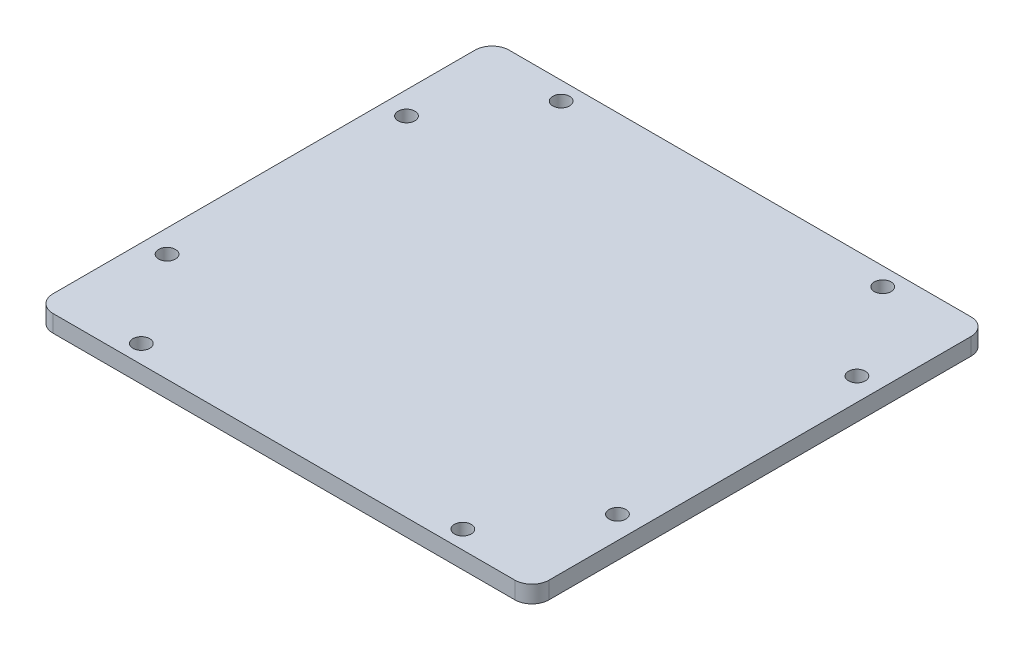
ISO-10303-21;
HEADER;
FILE_DESCRIPTION(('STEP AP214'),'2;1');
FILE_NAME('part.step','',(''),(''),'','','');
FILE_SCHEMA(('AUTOMOTIVE_DESIGN { 1 0 10303 214 1 1 1 1 }'));
ENDSEC;
DATA;
#1=APPLICATION_CONTEXT('core data for automotive mechanical design processes');
#2=APPLICATION_PROTOCOL_DEFINITION('international standard','automotive_design',2000,#1);
#3=PRODUCT_CONTEXT('',#1,'mechanical');
#4=PRODUCT('Part','Part','',(#3));
#5=PRODUCT_RELATED_PRODUCT_CATEGORY('part','',(#4));
#6=PRODUCT_DEFINITION_FORMATION('','',#4);
#7=PRODUCT_DEFINITION_CONTEXT('part definition',#1,'design');
#8=PRODUCT_DEFINITION('design','',#6,#7);
#9=PRODUCT_DEFINITION_SHAPE('','',#8);
#10=(LENGTH_UNIT() NAMED_UNIT(*) SI_UNIT(.MILLI.,.METRE.));
#11=(NAMED_UNIT(*) PLANE_ANGLE_UNIT() SI_UNIT($,.RADIAN.));
#12=(NAMED_UNIT(*) SI_UNIT($,.STERADIAN.) SOLID_ANGLE_UNIT());
#13=UNCERTAINTY_MEASURE_WITH_UNIT(LENGTH_MEASURE(1.E-05),#10,'distance_accuracy_value','');
#14=(GEOMETRIC_REPRESENTATION_CONTEXT(3) GLOBAL_UNCERTAINTY_ASSIGNED_CONTEXT((#13)) GLOBAL_UNIT_ASSIGNED_CONTEXT((#10,
#11,#12)) REPRESENTATION_CONTEXT('',''));
#15=CARTESIAN_POINT('',(0.,0.,0.));
#16=DIRECTION('',(0.,0.,1.));
#17=DIRECTION('',(1.,0.,0.));
#18=AXIS2_PLACEMENT_3D('',#15,#16,#17);
#19=CARTESIAN_POINT('',(40.5,3.,37.));
#20=DIRECTION('',(0.,-1.,0.));
#21=DIRECTION('',(0.,0.,-1.));
#22=AXIS2_PLACEMENT_3D('',#19,#20,#21);
#23=PLANE('',#22);
#24=CARTESIAN_POINT('',(40.5,3.,37.));
#25=DIRECTION('',(0.,1.,0.));
#26=DIRECTION('',(0.,0.,-1.));
#27=AXIS2_PLACEMENT_3D('',#24,#25,#26);
#28=CIRCLE('',#27,3.);
#29=CARTESIAN_POINT('',(40.5,3.,40.));
#30=VERTEX_POINT('',#29);
#31=CARTESIAN_POINT('',(43.5,3.,37.));
#32=VERTEX_POINT('',#31);
#33=EDGE_CURVE('E147',#30,#32,#28,.T.);
#34=ORIENTED_EDGE('',*,*,#33,.T.);
#35=DIRECTION('',(0.,0.,-1.));
#36=VECTOR('',#35,1.);
#37=CARTESIAN_POINT('',(43.5,3.,-37.));
#38=LINE('',#37,#36);
#39=CARTESIAN_POINT('',(43.5,3.,-37.));
#40=VERTEX_POINT('',#39);
#41=EDGE_CURVE('E95',#32,#40,#38,.T.);
#42=ORIENTED_EDGE('',*,*,#41,.T.);
#43=CARTESIAN_POINT('',(40.5,3.,-37.));
#44=DIRECTION('',(0.,1.,0.));
#45=DIRECTION('',(0.,0.,1.));
#46=AXIS2_PLACEMENT_3D('',#43,#44,#45);
#47=CIRCLE('',#46,3.);
#48=CARTESIAN_POINT('',(40.5,3.,-40.));
#49=VERTEX_POINT('',#48);
#50=EDGE_CURVE('E162',#40,#49,#47,.T.);
#51=ORIENTED_EDGE('',*,*,#50,.T.);
#52=DIRECTION('',(-1.,0.,0.));
#53=VECTOR('',#52,1.);
#54=CARTESIAN_POINT('',(-40.5,3.,-40.));
#55=LINE('',#54,#53);
#56=CARTESIAN_POINT('',(-40.5,3.,-40.));
#57=VERTEX_POINT('',#56);
#58=EDGE_CURVE('E175',#49,#57,#55,.T.);
#59=ORIENTED_EDGE('',*,*,#58,.T.);
#60=CARTESIAN_POINT('',(-40.5,3.,-37.));
#61=DIRECTION('',(0.,1.,0.));
#62=DIRECTION('',(0.,0.,1.));
#63=AXIS2_PLACEMENT_3D('',#60,#61,#62);
#64=CIRCLE('',#63,3.);
#65=CARTESIAN_POINT('',(-43.5,3.,-37.));
#66=VERTEX_POINT('',#65);
#67=EDGE_CURVE('E114',#57,#66,#64,.T.);
#68=ORIENTED_EDGE('',*,*,#67,.T.);
#69=DIRECTION('',(0.,0.,1.));
#70=VECTOR('',#69,1.);
#71=CARTESIAN_POINT('',(-43.5,3.,-37.));
#72=LINE('',#71,#70);
#73=CARTESIAN_POINT('',(-43.5,3.,37.));
#74=VERTEX_POINT('',#73);
#75=EDGE_CURVE('E108',#66,#74,#72,.T.);
#76=ORIENTED_EDGE('',*,*,#75,.T.);
#77=CARTESIAN_POINT('',(-40.5,3.,37.));
#78=DIRECTION('',(0.,1.,0.));
#79=DIRECTION('',(0.,0.,-1.));
#80=AXIS2_PLACEMENT_3D('',#77,#78,#79);
#81=CIRCLE('',#80,3.);
#82=CARTESIAN_POINT('',(-40.5,3.,40.));
#83=VERTEX_POINT('',#82);
#84=EDGE_CURVE('E112',#74,#83,#81,.T.);
#85=ORIENTED_EDGE('',*,*,#84,.T.);
#86=DIRECTION('',(1.,0.,0.));
#87=VECTOR('',#86,1.);
#88=CARTESIAN_POINT('',(-40.5,3.,40.));
#89=LINE('',#88,#87);
#90=EDGE_CURVE('E52',#83,#30,#89,.T.);
#91=ORIENTED_EDGE('',*,*,#90,.T.);
#92=EDGE_LOOP('',(#34,#42,#51,#59,#68,#76,#85,#91));
#93=FACE_BOUND('',#92,.T.);
#94=CARTESIAN_POINT('',(28.198,3.,36.819));
#95=DIRECTION('',(0.,1.,0.));
#96=DIRECTION('',(0.,0.,1.));
#97=AXIS2_PLACEMENT_3D('',#94,#95,#96);
#98=CIRCLE('',#97,1.475);
#99=CARTESIAN_POINT('',(28.198,3.,38.294));
#100=VERTEX_POINT('',#99);
#101=EDGE_CURVE('E136',#100,#100,#98,.T.);
#102=ORIENTED_EDGE('',*,*,#101,.F.);
#103=EDGE_LOOP('',(#102));
#104=FACE_BOUND('',#103,.T.);
#105=CARTESIAN_POINT('',(28.198,3.,-36.819));
#106=DIRECTION('',(0.,1.,0.));
#107=DIRECTION('',(0.,0.,-1.));
#108=AXIS2_PLACEMENT_3D('',#105,#106,#107);
#109=CIRCLE('',#108,1.475);
#110=CARTESIAN_POINT('',(28.198,3.,-38.294));
#111=VERTEX_POINT('',#110);
#112=EDGE_CURVE('E184',#111,#111,#109,.T.);
#113=ORIENTED_EDGE('',*,*,#112,.F.);
#114=EDGE_LOOP('',(#113));
#115=FACE_BOUND('',#114,.T.);
#116=CARTESIAN_POINT('',(-28.198,3.,-36.819));
#117=DIRECTION('',(0.,1.,0.));
#118=DIRECTION('',(0.,0.,1.));
#119=AXIS2_PLACEMENT_3D('',#116,#117,#118);
#120=CIRCLE('',#119,1.475);
#121=CARTESIAN_POINT('',(-28.198,3.,-35.344));
#122=VERTEX_POINT('',#121);
#123=EDGE_CURVE('E190',#122,#122,#120,.T.);
#124=ORIENTED_EDGE('',*,*,#123,.F.);
#125=EDGE_LOOP('',(#124));
#126=FACE_BOUND('',#125,.T.);
#127=CARTESIAN_POINT('',(-28.198,3.,36.819));
#128=DIRECTION('',(0.,1.,0.));
#129=DIRECTION('',(0.,0.,-1.));
#130=AXIS2_PLACEMENT_3D('',#127,#128,#129);
#131=CIRCLE('',#130,1.475);
#132=CARTESIAN_POINT('',(-28.198,3.,35.344));
#133=VERTEX_POINT('',#132);
#134=EDGE_CURVE('E196',#133,#133,#131,.T.);
#135=ORIENTED_EDGE('',*,*,#134,.F.);
#136=EDGE_LOOP('',(#135));
#137=FACE_BOUND('',#136,.T.);
#138=CARTESIAN_POINT('',(39.5,3.,-21.));
#139=DIRECTION('',(0.,1.,0.));
#140=DIRECTION('',(0.,0.,1.));
#141=AXIS2_PLACEMENT_3D('',#138,#139,#140);
#142=CIRCLE('',#141,1.475);
#143=CARTESIAN_POINT('',(39.5,3.,-19.525));
#144=VERTEX_POINT('',#143);
#145=EDGE_CURVE('E202',#144,#144,#142,.T.);
#146=ORIENTED_EDGE('',*,*,#145,.F.);
#147=EDGE_LOOP('',(#146));
#148=FACE_BOUND('',#147,.T.);
#149=CARTESIAN_POINT('',(-39.5,3.,-21.));
#150=DIRECTION('',(0.,1.,0.));
#151=DIRECTION('',(0.,0.,-1.));
#152=AXIS2_PLACEMENT_3D('',#149,#150,#151);
#153=CIRCLE('',#152,1.475);
#154=CARTESIAN_POINT('',(-39.5,3.,-22.475));
#155=VERTEX_POINT('',#154);
#156=EDGE_CURVE('E208',#155,#155,#153,.T.);
#157=ORIENTED_EDGE('',*,*,#156,.F.);
#158=EDGE_LOOP('',(#157));
#159=FACE_BOUND('',#158,.T.);
#160=CARTESIAN_POINT('',(39.5,3.,21.));
#161=DIRECTION('',(0.,1.,0.));
#162=DIRECTION('',(0.,0.,-1.));
#163=AXIS2_PLACEMENT_3D('',#160,#161,#162);
#164=CIRCLE('',#163,1.475);
#165=CARTESIAN_POINT('',(39.5,3.,19.525));
#166=VERTEX_POINT('',#165);
#167=EDGE_CURVE('E214',#166,#166,#164,.T.);
#168=ORIENTED_EDGE('',*,*,#167,.F.);
#169=EDGE_LOOP('',(#168));
#170=FACE_BOUND('',#169,.T.);
#171=CARTESIAN_POINT('',(-39.5,3.,21.));
#172=DIRECTION('',(0.,1.,0.));
#173=DIRECTION('',(0.,0.,1.));
#174=AXIS2_PLACEMENT_3D('',#171,#172,#173);
#175=CIRCLE('',#174,1.475);
#176=CARTESIAN_POINT('',(-39.5,3.,22.475));
#177=VERTEX_POINT('',#176);
#178=EDGE_CURVE('E220',#177,#177,#175,.T.);
#179=ORIENTED_EDGE('',*,*,#178,.F.);
#180=EDGE_LOOP('',(#179));
#181=FACE_BOUND('',#180,.T.);
#182=ADVANCED_FACE('F35',(#93,#104,#115,#126,#137,#148,#159,#170,#181),#23,.F.);
#183=CARTESIAN_POINT('',(40.5,0.,37.));
#184=DIRECTION('',(0.,-1.,0.));
#185=DIRECTION('',(0.,0.,-1.));
#186=AXIS2_PLACEMENT_3D('',#183,#184,#185);
#187=PLANE('',#186);
#188=CARTESIAN_POINT('',(39.5,0.,21.));
#189=DIRECTION('',(0.,1.,0.));
#190=DIRECTION('',(0.,0.,-1.));
#191=AXIS2_PLACEMENT_3D('',#188,#189,#190);
#192=CIRCLE('',#191,1.475);
#193=CARTESIAN_POINT('',(39.5,0.,19.525));
#194=VERTEX_POINT('',#193);
#195=EDGE_CURVE('E217',#194,#194,#192,.T.);
#196=ORIENTED_EDGE('',*,*,#195,.T.);
#197=EDGE_LOOP('',(#196));
#198=FACE_BOUND('',#197,.T.);
#199=CARTESIAN_POINT('',(39.5,0.,-21.));
#200=DIRECTION('',(0.,1.,0.));
#201=DIRECTION('',(0.,0.,1.));
#202=AXIS2_PLACEMENT_3D('',#199,#200,#201);
#203=CIRCLE('',#202,1.475);
#204=CARTESIAN_POINT('',(39.5,0.,-19.525));
#205=VERTEX_POINT('',#204);
#206=EDGE_CURVE('E205',#205,#205,#203,.T.);
#207=ORIENTED_EDGE('',*,*,#206,.T.);
#208=EDGE_LOOP('',(#207));
#209=FACE_BOUND('',#208,.T.);
#210=CARTESIAN_POINT('',(-28.198,0.,-36.819));
#211=DIRECTION('',(0.,1.,0.));
#212=DIRECTION('',(0.,0.,1.));
#213=AXIS2_PLACEMENT_3D('',#210,#211,#212);
#214=CIRCLE('',#213,1.475);
#215=CARTESIAN_POINT('',(-28.198,0.,-35.344));
#216=VERTEX_POINT('',#215);
#217=EDGE_CURVE('E193',#216,#216,#214,.T.);
#218=ORIENTED_EDGE('',*,*,#217,.T.);
#219=EDGE_LOOP('',(#218));
#220=FACE_BOUND('',#219,.T.);
#221=CARTESIAN_POINT('',(28.198,0.,36.819));
#222=DIRECTION('',(0.,1.,0.));
#223=DIRECTION('',(0.,0.,1.));
#224=AXIS2_PLACEMENT_3D('',#221,#222,#223);
#225=CIRCLE('',#224,1.475);
#226=CARTESIAN_POINT('',(28.198,0.,38.294));
#227=VERTEX_POINT('',#226);
#228=EDGE_CURVE('E181',#227,#227,#225,.T.);
#229=ORIENTED_EDGE('',*,*,#228,.T.);
#230=EDGE_LOOP('',(#229));
#231=FACE_BOUND('',#230,.T.);
#232=CARTESIAN_POINT('',(40.5,0.,37.));
#233=DIRECTION('',(0.,1.,0.));
#234=DIRECTION('',(0.,0.,-1.));
#235=AXIS2_PLACEMENT_3D('',#232,#233,#234);
#236=CIRCLE('',#235,3.);
#237=CARTESIAN_POINT('',(40.5,0.,40.));
#238=VERTEX_POINT('',#237);
#239=CARTESIAN_POINT('',(43.5,0.,37.));
#240=VERTEX_POINT('',#239);
#241=EDGE_CURVE('E132',#238,#240,#236,.T.);
#242=ORIENTED_EDGE('',*,*,#241,.F.);
#243=DIRECTION('',(1.,0.,0.));
#244=VECTOR('',#243,1.);
#245=CARTESIAN_POINT('',(-40.5,0.,40.));
#246=LINE('',#245,#244);
#247=CARTESIAN_POINT('',(-40.5,0.,40.));
#248=VERTEX_POINT('',#247);
#249=EDGE_CURVE('E87',#248,#238,#246,.T.);
#250=ORIENTED_EDGE('',*,*,#249,.F.);
#251=CARTESIAN_POINT('',(-40.5,0.,37.));
#252=DIRECTION('',(0.,1.,0.));
#253=DIRECTION('',(0.,0.,-1.));
#254=AXIS2_PLACEMENT_3D('',#251,#252,#253);
#255=CIRCLE('',#254,3.);
#256=CARTESIAN_POINT('',(-43.5,0.,37.));
#257=VERTEX_POINT('',#256);
#258=EDGE_CURVE('E81',#257,#248,#255,.T.);
#259=ORIENTED_EDGE('',*,*,#258,.F.);
#260=DIRECTION('',(0.,0.,1.));
#261=VECTOR('',#260,1.);
#262=CARTESIAN_POINT('',(-43.5,0.,-37.));
#263=LINE('',#262,#261);
#264=CARTESIAN_POINT('',(-43.5,0.,-37.));
#265=VERTEX_POINT('',#264);
#266=EDGE_CURVE('E122',#265,#257,#263,.T.);
#267=ORIENTED_EDGE('',*,*,#266,.F.);
#268=CARTESIAN_POINT('',(-40.5,0.,-37.));
#269=DIRECTION('',(0.,1.,0.));
#270=DIRECTION('',(0.,0.,1.));
#271=AXIS2_PLACEMENT_3D('',#268,#269,#270);
#272=CIRCLE('',#271,3.);
#273=CARTESIAN_POINT('',(-40.5,0.,-40.));
#274=VERTEX_POINT('',#273);
#275=EDGE_CURVE('E142',#274,#265,#272,.T.);
#276=ORIENTED_EDGE('',*,*,#275,.F.);
#277=DIRECTION('',(-1.,0.,0.));
#278=VECTOR('',#277,1.);
#279=CARTESIAN_POINT('',(-40.5,0.,-40.));
#280=LINE('',#279,#278);
#281=CARTESIAN_POINT('',(40.5,0.,-40.));
#282=VERTEX_POINT('',#281);
#283=EDGE_CURVE('E140',#282,#274,#280,.T.);
#284=ORIENTED_EDGE('',*,*,#283,.F.);
#285=CARTESIAN_POINT('',(40.5,0.,-37.));
#286=DIRECTION('',(0.,1.,0.));
#287=DIRECTION('',(0.,0.,1.));
#288=AXIS2_PLACEMENT_3D('',#285,#286,#287);
#289=CIRCLE('',#288,3.);
#290=CARTESIAN_POINT('',(43.5,0.,-37.));
#291=VERTEX_POINT('',#290);
#292=EDGE_CURVE('E138',#291,#282,#289,.T.);
#293=ORIENTED_EDGE('',*,*,#292,.F.);
#294=DIRECTION('',(0.,0.,-1.));
#295=VECTOR('',#294,1.);
#296=CARTESIAN_POINT('',(43.5,0.,-37.));
#297=LINE('',#296,#295);
#298=EDGE_CURVE('E135',#240,#291,#297,.T.);
#299=ORIENTED_EDGE('',*,*,#298,.F.);
#300=EDGE_LOOP('',(#242,#250,#259,#267,#276,#284,#293,#299));
#301=FACE_BOUND('',#300,.T.);
#302=CARTESIAN_POINT('',(28.198,0.,-36.819));
#303=DIRECTION('',(0.,1.,0.));
#304=DIRECTION('',(0.,0.,-1.));
#305=AXIS2_PLACEMENT_3D('',#302,#303,#304);
#306=CIRCLE('',#305,1.475);
#307=CARTESIAN_POINT('',(28.198,0.,-38.294));
#308=VERTEX_POINT('',#307);
#309=EDGE_CURVE('E187',#308,#308,#306,.T.);
#310=ORIENTED_EDGE('',*,*,#309,.T.);
#311=EDGE_LOOP('',(#310));
#312=FACE_BOUND('',#311,.T.);
#313=CARTESIAN_POINT('',(-28.198,0.,36.819));
#314=DIRECTION('',(0.,1.,0.));
#315=DIRECTION('',(0.,0.,-1.));
#316=AXIS2_PLACEMENT_3D('',#313,#314,#315);
#317=CIRCLE('',#316,1.475);
#318=CARTESIAN_POINT('',(-28.198,0.,35.344));
#319=VERTEX_POINT('',#318);
#320=EDGE_CURVE('E199',#319,#319,#317,.T.);
#321=ORIENTED_EDGE('',*,*,#320,.T.);
#322=EDGE_LOOP('',(#321));
#323=FACE_BOUND('',#322,.T.);
#324=CARTESIAN_POINT('',(-39.5,0.,-21.));
#325=DIRECTION('',(0.,1.,0.));
#326=DIRECTION('',(0.,0.,-1.));
#327=AXIS2_PLACEMENT_3D('',#324,#325,#326);
#328=CIRCLE('',#327,1.475);
#329=CARTESIAN_POINT('',(-39.5,0.,-22.475));
#330=VERTEX_POINT('',#329);
#331=EDGE_CURVE('E211',#330,#330,#328,.T.);
#332=ORIENTED_EDGE('',*,*,#331,.T.);
#333=EDGE_LOOP('',(#332));
#334=FACE_BOUND('',#333,.T.);
#335=CARTESIAN_POINT('',(-39.5,0.,21.));
#336=DIRECTION('',(0.,1.,0.));
#337=DIRECTION('',(0.,0.,1.));
#338=AXIS2_PLACEMENT_3D('',#335,#336,#337);
#339=CIRCLE('',#338,1.475);
#340=CARTESIAN_POINT('',(-39.5,0.,22.475));
#341=VERTEX_POINT('',#340);
#342=EDGE_CURVE('E223',#341,#341,#339,.T.);
#343=ORIENTED_EDGE('',*,*,#342,.T.);
#344=EDGE_LOOP('',(#343));
#345=FACE_BOUND('',#344,.T.);
#346=ADVANCED_FACE('F166',(#198,#209,#220,#231,#301,#312,#323,#334,#345),#187,.T.);
#347=CARTESIAN_POINT('',(40.5,3.,37.));
#348=DIRECTION('',(0.,-1.,0.));
#349=DIRECTION('',(0.,0.,-1.));
#350=AXIS2_PLACEMENT_3D('',#347,#348,#349);
#351=CYLINDRICAL_SURFACE('',#350,3.);
#352=ORIENTED_EDGE('',*,*,#241,.T.);
#353=DIRECTION('',(0.,-1.,0.));
#354=VECTOR('',#353,1.);
#355=CARTESIAN_POINT('',(43.5,3.,37.));
#356=LINE('',#355,#354);
#357=EDGE_CURVE('E11',#32,#240,#356,.T.);
#358=ORIENTED_EDGE('',*,*,#357,.F.);
#359=ORIENTED_EDGE('',*,*,#33,.F.);
#360=DIRECTION('',(0.,-1.,0.));
#361=VECTOR('',#360,1.);
#362=CARTESIAN_POINT('',(40.5,3.,40.));
#363=LINE('',#362,#361);
#364=EDGE_CURVE('E128',#30,#238,#363,.T.);
#365=ORIENTED_EDGE('',*,*,#364,.T.);
#366=EDGE_LOOP('',(#352,#358,#359,#365));
#367=FACE_BOUND('',#366,.T.);
#368=ADVANCED_FACE('F37',(#367),#351,.T.);
#369=CARTESIAN_POINT('',(43.5,3.,-37.));
#370=DIRECTION('',(-1.,0.,0.));
#371=DIRECTION('',(0.,0.,1.));
#372=AXIS2_PLACEMENT_3D('',#369,#370,#371);
#373=PLANE('',#372);
#374=ORIENTED_EDGE('',*,*,#298,.T.);
#375=DIRECTION('',(0.,-1.,0.));
#376=VECTOR('',#375,1.);
#377=CARTESIAN_POINT('',(43.5,3.,-37.));
#378=LINE('',#377,#376);
#379=EDGE_CURVE('E44',#40,#291,#378,.T.);
#380=ORIENTED_EDGE('',*,*,#379,.F.);
#381=ORIENTED_EDGE('',*,*,#41,.F.);
#382=ORIENTED_EDGE('',*,*,#357,.T.);
#383=EDGE_LOOP('',(#374,#380,#381,#382));
#384=FACE_BOUND('',#383,.T.);
#385=ADVANCED_FACE('F255',(#384),#373,.F.);
#386=CARTESIAN_POINT('',(40.5,3.,-37.));
#387=DIRECTION('',(0.,-1.,0.));
#388=DIRECTION('',(0.,0.,-1.));
#389=AXIS2_PLACEMENT_3D('',#386,#387,#388);
#390=CYLINDRICAL_SURFACE('',#389,3.);
#391=ORIENTED_EDGE('',*,*,#292,.T.);
#392=DIRECTION('',(0.,-1.,0.));
#393=VECTOR('',#392,1.);
#394=CARTESIAN_POINT('',(40.5,3.,-40.));
#395=LINE('',#394,#393);
#396=EDGE_CURVE('E154',#49,#282,#395,.T.);
#397=ORIENTED_EDGE('',*,*,#396,.F.);
#398=ORIENTED_EDGE('',*,*,#50,.F.);
#399=ORIENTED_EDGE('',*,*,#379,.T.);
#400=EDGE_LOOP('',(#391,#397,#398,#399));
#401=FACE_BOUND('',#400,.T.);
#402=ADVANCED_FACE('F160',(#401),#390,.T.);
#403=CARTESIAN_POINT('',(-40.5,3.,-40.));
#404=DIRECTION('',(0.,0.,1.));
#405=DIRECTION('',(1.,0.,0.));
#406=AXIS2_PLACEMENT_3D('',#403,#404,#405);
#407=PLANE('',#406);
#408=ORIENTED_EDGE('',*,*,#283,.T.);
#409=DIRECTION('',(0.,-1.,0.));
#410=VECTOR('',#409,1.);
#411=CARTESIAN_POINT('',(-40.5,3.,-40.));
#412=LINE('',#411,#410);
#413=EDGE_CURVE('E151',#57,#274,#412,.T.);
#414=ORIENTED_EDGE('',*,*,#413,.F.);
#415=ORIENTED_EDGE('',*,*,#58,.F.);
#416=ORIENTED_EDGE('',*,*,#396,.T.);
#417=EDGE_LOOP('',(#408,#414,#415,#416));
#418=FACE_BOUND('',#417,.T.);
#419=ADVANCED_FACE('F171',(#418),#407,.F.);
#420=CARTESIAN_POINT('',(-40.5,3.,-37.));
#421=DIRECTION('',(0.,-1.,0.));
#422=DIRECTION('',(0.,0.,-1.));
#423=AXIS2_PLACEMENT_3D('',#420,#421,#422);
#424=CYLINDRICAL_SURFACE('',#423,3.);
#425=ORIENTED_EDGE('',*,*,#275,.T.);
#426=DIRECTION('',(0.,-1.,0.));
#427=VECTOR('',#426,1.);
#428=CARTESIAN_POINT('',(-43.5,3.,-37.));
#429=LINE('',#428,#427);
#430=EDGE_CURVE('E123',#66,#265,#429,.T.);
#431=ORIENTED_EDGE('',*,*,#430,.F.);
#432=ORIENTED_EDGE('',*,*,#67,.F.);
#433=ORIENTED_EDGE('',*,*,#413,.T.);
#434=EDGE_LOOP('',(#425,#431,#432,#433));
#435=FACE_BOUND('',#434,.T.);
#436=ADVANCED_FACE('F174',(#435),#424,.T.);
#437=CARTESIAN_POINT('',(-43.5,3.,-37.));
#438=DIRECTION('',(1.,0.,0.));
#439=DIRECTION('',(0.,0.,-1.));
#440=AXIS2_PLACEMENT_3D('',#437,#438,#439);
#441=PLANE('',#440);
#442=ORIENTED_EDGE('',*,*,#266,.T.);
#443=DIRECTION('',(0.,-1.,0.));
#444=VECTOR('',#443,1.);
#445=CARTESIAN_POINT('',(-43.5,3.,37.));
#446=LINE('',#445,#444);
#447=EDGE_CURVE('E119',#74,#257,#446,.T.);
#448=ORIENTED_EDGE('',*,*,#447,.F.);
#449=ORIENTED_EDGE('',*,*,#75,.F.);
#450=ORIENTED_EDGE('',*,*,#430,.T.);
#451=EDGE_LOOP('',(#442,#448,#449,#450));
#452=FACE_BOUND('',#451,.T.);
#453=ADVANCED_FACE('F120',(#452),#441,.F.);
#454=CARTESIAN_POINT('',(-40.5,3.,37.));
#455=DIRECTION('',(0.,-1.,0.));
#456=DIRECTION('',(0.,0.,-1.));
#457=AXIS2_PLACEMENT_3D('',#454,#455,#456);
#458=CYLINDRICAL_SURFACE('',#457,3.);
#459=ORIENTED_EDGE('',*,*,#258,.T.);
#460=DIRECTION('',(0.,-1.,0.));
#461=VECTOR('',#460,1.);
#462=CARTESIAN_POINT('',(-40.5,3.,40.));
#463=LINE('',#462,#461);
#464=EDGE_CURVE('E124',#83,#248,#463,.T.);
#465=ORIENTED_EDGE('',*,*,#464,.F.);
#466=ORIENTED_EDGE('',*,*,#84,.F.);
#467=ORIENTED_EDGE('',*,*,#447,.T.);
#468=EDGE_LOOP('',(#459,#465,#466,#467));
#469=FACE_BOUND('',#468,.T.);
#470=ADVANCED_FACE('F126',(#469),#458,.T.);
#471=CARTESIAN_POINT('',(-40.5,3.,40.));
#472=DIRECTION('',(0.,0.,-1.));
#473=DIRECTION('',(-1.,0.,0.));
#474=AXIS2_PLACEMENT_3D('',#471,#472,#473);
#475=PLANE('',#474);
#476=ORIENTED_EDGE('',*,*,#249,.T.);
#477=ORIENTED_EDGE('',*,*,#364,.F.);
#478=ORIENTED_EDGE('',*,*,#90,.F.);
#479=ORIENTED_EDGE('',*,*,#464,.T.);
#480=EDGE_LOOP('',(#476,#477,#478,#479));
#481=FACE_BOUND('',#480,.T.);
#482=ADVANCED_FACE('F243',(#481),#475,.F.);
#483=CARTESIAN_POINT('',(28.198,3.,36.819));
#484=DIRECTION('',(0.,-1.,0.));
#485=DIRECTION('',(0.,0.,-1.));
#486=AXIS2_PLACEMENT_3D('',#483,#484,#485);
#487=CYLINDRICAL_SURFACE('',#486,1.475);
#488=ORIENTED_EDGE('',*,*,#101,.T.);
#489=EDGE_LOOP('',(#488));
#490=FACE_BOUND('',#489,.T.);
#491=ORIENTED_EDGE('',*,*,#228,.F.);
#492=EDGE_LOOP('',(#491));
#493=FACE_BOUND('',#492,.T.);
#494=ADVANCED_FACE('F240',(#490,#493),#487,.F.);
#495=CARTESIAN_POINT('',(28.198,3.,-36.819));
#496=DIRECTION('',(0.,-1.,0.));
#497=DIRECTION('',(0.,0.,-1.));
#498=AXIS2_PLACEMENT_3D('',#495,#496,#497);
#499=CYLINDRICAL_SURFACE('',#498,1.475);
#500=ORIENTED_EDGE('',*,*,#112,.T.);
#501=EDGE_LOOP('',(#500));
#502=FACE_BOUND('',#501,.T.);
#503=ORIENTED_EDGE('',*,*,#309,.F.);
#504=EDGE_LOOP('',(#503));
#505=FACE_BOUND('',#504,.T.);
#506=ADVANCED_FACE('F321',(#502,#505),#499,.F.);
#507=CARTESIAN_POINT('',(-28.198,3.,-36.819));
#508=DIRECTION('',(0.,-1.,0.));
#509=DIRECTION('',(0.,0.,-1.));
#510=AXIS2_PLACEMENT_3D('',#507,#508,#509);
#511=CYLINDRICAL_SURFACE('',#510,1.475);
#512=ORIENTED_EDGE('',*,*,#123,.T.);
#513=EDGE_LOOP('',(#512));
#514=FACE_BOUND('',#513,.T.);
#515=ORIENTED_EDGE('',*,*,#217,.F.);
#516=EDGE_LOOP('',(#515));
#517=FACE_BOUND('',#516,.T.);
#518=ADVANCED_FACE('F329',(#514,#517),#511,.F.);
#519=CARTESIAN_POINT('',(-28.198,3.,36.819));
#520=DIRECTION('',(0.,-1.,0.));
#521=DIRECTION('',(0.,0.,-1.));
#522=AXIS2_PLACEMENT_3D('',#519,#520,#521);
#523=CYLINDRICAL_SURFACE('',#522,1.475);
#524=ORIENTED_EDGE('',*,*,#134,.T.);
#525=EDGE_LOOP('',(#524));
#526=FACE_BOUND('',#525,.T.);
#527=ORIENTED_EDGE('',*,*,#320,.F.);
#528=EDGE_LOOP('',(#527));
#529=FACE_BOUND('',#528,.T.);
#530=ADVANCED_FACE('F337',(#526,#529),#523,.F.);
#531=CARTESIAN_POINT('',(39.5,3.,-21.));
#532=DIRECTION('',(0.,-1.,0.));
#533=DIRECTION('',(0.,0.,-1.));
#534=AXIS2_PLACEMENT_3D('',#531,#532,#533);
#535=CYLINDRICAL_SURFACE('',#534,1.475);
#536=ORIENTED_EDGE('',*,*,#145,.T.);
#537=EDGE_LOOP('',(#536));
#538=FACE_BOUND('',#537,.T.);
#539=ORIENTED_EDGE('',*,*,#206,.F.);
#540=EDGE_LOOP('',(#539));
#541=FACE_BOUND('',#540,.T.);
#542=ADVANCED_FACE('F346',(#538,#541),#535,.F.);
#543=CARTESIAN_POINT('',(-39.5,3.,-21.));
#544=DIRECTION('',(0.,-1.,0.));
#545=DIRECTION('',(0.,0.,-1.));
#546=AXIS2_PLACEMENT_3D('',#543,#544,#545);
#547=CYLINDRICAL_SURFACE('',#546,1.475);
#548=ORIENTED_EDGE('',*,*,#156,.T.);
#549=EDGE_LOOP('',(#548));
#550=FACE_BOUND('',#549,.T.);
#551=ORIENTED_EDGE('',*,*,#331,.F.);
#552=EDGE_LOOP('',(#551));
#553=FACE_BOUND('',#552,.T.);
#554=ADVANCED_FACE('F355',(#550,#553),#547,.F.);
#555=CARTESIAN_POINT('',(39.5,3.,21.));
#556=DIRECTION('',(0.,-1.,0.));
#557=DIRECTION('',(0.,0.,-1.));
#558=AXIS2_PLACEMENT_3D('',#555,#556,#557);
#559=CYLINDRICAL_SURFACE('',#558,1.475);
#560=ORIENTED_EDGE('',*,*,#167,.T.);
#561=EDGE_LOOP('',(#560));
#562=FACE_BOUND('',#561,.T.);
#563=ORIENTED_EDGE('',*,*,#195,.F.);
#564=EDGE_LOOP('',(#563));
#565=FACE_BOUND('',#564,.T.);
#566=ADVANCED_FACE('F364',(#562,#565),#559,.F.);
#567=CARTESIAN_POINT('',(-39.5,3.,21.));
#568=DIRECTION('',(0.,-1.,0.));
#569=DIRECTION('',(0.,0.,-1.));
#570=AXIS2_PLACEMENT_3D('',#567,#568,#569);
#571=CYLINDRICAL_SURFACE('',#570,1.475);
#572=ORIENTED_EDGE('',*,*,#178,.T.);
#573=EDGE_LOOP('',(#572));
#574=FACE_BOUND('',#573,.T.);
#575=ORIENTED_EDGE('',*,*,#342,.F.);
#576=EDGE_LOOP('',(#575));
#577=FACE_BOUND('',#576,.T.);
#578=ADVANCED_FACE('F229',(#574,#577),#571,.F.);
#579=CLOSED_SHELL('',(#182,#346,#368,#385,#402,#419,#436,#453,#470,#482,#494,#506,#518,#530,
#542,#554,#566,#578));
#580=MANIFOLD_SOLID_BREP('B2',#579);
#581=ADVANCED_BREP_SHAPE_REPRESENTATION('',(#18,#580),#14);
#582=SHAPE_DEFINITION_REPRESENTATION(#9,#581);
ENDSEC;
END-ISO-10303-21;
